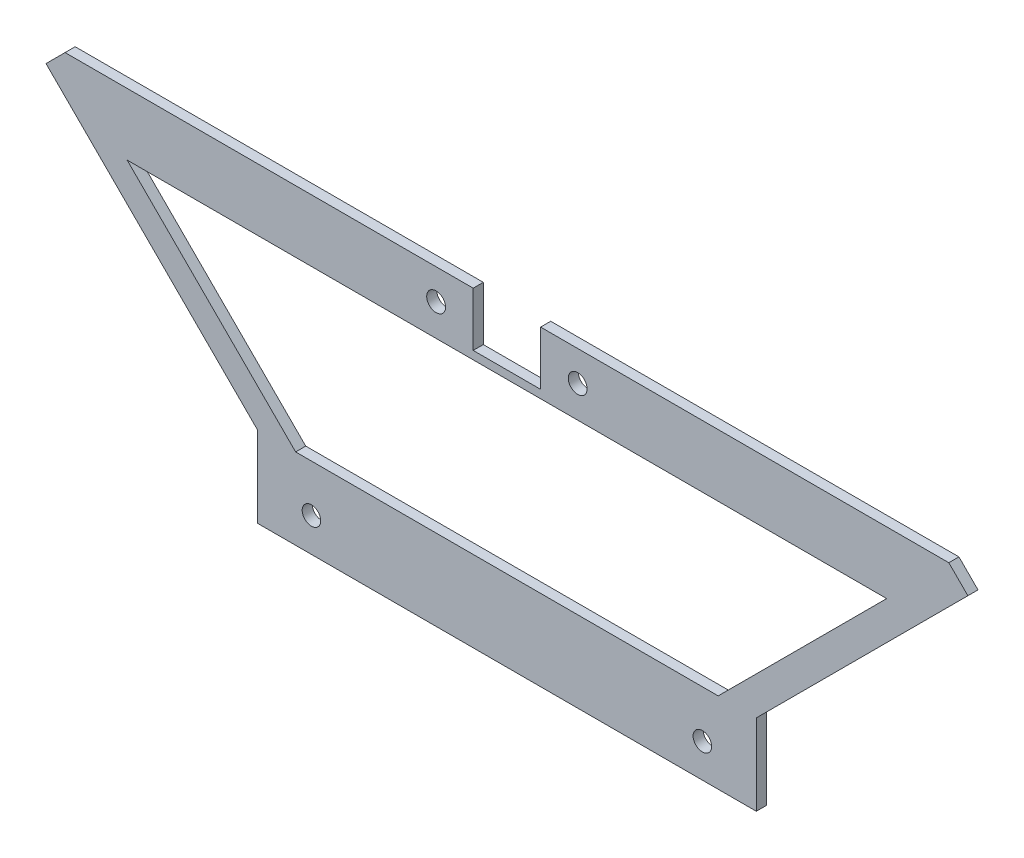
ISO-10303-21;
HEADER;
FILE_DESCRIPTION(('STEP AP214'),'2;1');
FILE_NAME('part.step','',(''),(''),'','','');
FILE_SCHEMA(('AUTOMOTIVE_DESIGN { 1 0 10303 214 1 1 1 1 }'));
ENDSEC;
DATA;
#1=APPLICATION_CONTEXT('core data for automotive mechanical design processes');
#2=APPLICATION_PROTOCOL_DEFINITION('international standard','automotive_design',2000,#1);
#3=PRODUCT_CONTEXT('',#1,'mechanical');
#4=PRODUCT('Part','Part','',(#3));
#5=PRODUCT_RELATED_PRODUCT_CATEGORY('part','',(#4));
#6=PRODUCT_DEFINITION_FORMATION('','',#4);
#7=PRODUCT_DEFINITION_CONTEXT('part definition',#1,'design');
#8=PRODUCT_DEFINITION('design','',#6,#7);
#9=PRODUCT_DEFINITION_SHAPE('','',#8);
#10=(LENGTH_UNIT() NAMED_UNIT(*) SI_UNIT(.MILLI.,.METRE.));
#11=(NAMED_UNIT(*) PLANE_ANGLE_UNIT() SI_UNIT($,.RADIAN.));
#12=(NAMED_UNIT(*) SI_UNIT($,.STERADIAN.) SOLID_ANGLE_UNIT());
#13=UNCERTAINTY_MEASURE_WITH_UNIT(LENGTH_MEASURE(1.E-05),#10,'distance_accuracy_value','');
#14=(GEOMETRIC_REPRESENTATION_CONTEXT(3) GLOBAL_UNCERTAINTY_ASSIGNED_CONTEXT((#13)) GLOBAL_UNIT_ASSIGNED_CONTEXT((#10,
#11,#12)) REPRESENTATION_CONTEXT('',''));
#15=CARTESIAN_POINT('',(0.,0.,0.));
#16=DIRECTION('',(0.,0.,1.));
#17=DIRECTION('',(1.,0.,0.));
#18=AXIS2_PLACEMENT_3D('',#15,#16,#17);
#19=CARTESIAN_POINT('',(37.,0.,1.5));
#20=DIRECTION('',(1.,0.,0.));
#21=DIRECTION('',(0.,0.,-1.));
#22=AXIS2_PLACEMENT_3D('',#19,#20,#21);
#23=PLANE('',#22);
#24=DIRECTION('',(0.,-1.,0.));
#25=VECTOR('',#24,1.);
#26=CARTESIAN_POINT('',(37.,0.,0.));
#27=LINE('',#26,#25);
#28=CARTESIAN_POINT('',(37.,12.,0.));
#29=VERTEX_POINT('',#28);
#30=CARTESIAN_POINT('',(37.,0.,0.));
#31=VERTEX_POINT('',#30);
#32=EDGE_CURVE('E281',#29,#31,#27,.T.);
#33=ORIENTED_EDGE('',*,*,#32,.F.);
#34=DIRECTION('',(0.,0.,-1.));
#35=VECTOR('',#34,1.);
#36=CARTESIAN_POINT('',(37.,12.,1.5));
#37=LINE('',#36,#35);
#38=CARTESIAN_POINT('',(37.,12.,1.5));
#39=VERTEX_POINT('',#38);
#40=EDGE_CURVE('E11',#39,#29,#37,.T.);
#41=ORIENTED_EDGE('',*,*,#40,.F.);
#42=DIRECTION('',(0.,-1.,0.));
#43=VECTOR('',#42,1.);
#44=CARTESIAN_POINT('',(37.,0.,1.5));
#45=LINE('',#44,#43);
#46=CARTESIAN_POINT('',(37.,0.,1.5));
#47=VERTEX_POINT('',#46);
#48=EDGE_CURVE('E340',#39,#47,#45,.T.);
#49=ORIENTED_EDGE('',*,*,#48,.T.);
#50=DIRECTION('',(0.,0.,-1.));
#51=VECTOR('',#50,1.);
#52=CARTESIAN_POINT('',(37.,0.,1.5));
#53=LINE('',#52,#51);
#54=EDGE_CURVE('E117',#47,#31,#53,.T.);
#55=ORIENTED_EDGE('',*,*,#54,.T.);
#56=EDGE_LOOP('',(#33,#41,#49,#55));
#57=FACE_BOUND('',#56,.T.);
#58=ADVANCED_FACE('F39',(#57),#23,.T.);
#59=CARTESIAN_POINT('',(12.5000000000001,-12.5,1.5));
#60=DIRECTION('',(0.707106781186548,-0.707106781186547,0.));
#61=DIRECTION('',(0.707106781186547,0.707106781186548,0.));
#62=AXIS2_PLACEMENT_3D('',#59,#60,#61);
#63=PLANE('',#62);
#64=DIRECTION('',(-0.707106781186547,-0.707106781186548,0.));
#65=VECTOR('',#64,1.);
#66=CARTESIAN_POINT('',(12.5000000000001,-12.5,0.));
#67=LINE('',#66,#65);
#68=CARTESIAN_POINT('',(68.3908729652601,43.3908729652602,0.));
#69=VERTEX_POINT('',#68);
#70=EDGE_CURVE('E277',#69,#29,#67,.T.);
#71=ORIENTED_EDGE('',*,*,#70,.F.);
#72=DIRECTION('',(0.,0.,-1.));
#73=VECTOR('',#72,1.);
#74=CARTESIAN_POINT('',(68.3908729652601,43.3908729652602,1.5));
#75=LINE('',#74,#73);
#76=CARTESIAN_POINT('',(68.3908729652601,43.3908729652602,1.5));
#77=VERTEX_POINT('',#76);
#78=EDGE_CURVE('E50',#77,#69,#75,.T.);
#79=ORIENTED_EDGE('',*,*,#78,.F.);
#80=DIRECTION('',(-0.707106781186547,-0.707106781186548,0.));
#81=VECTOR('',#80,1.);
#82=CARTESIAN_POINT('',(12.5000000000001,-12.5,1.5));
#83=LINE('',#82,#81);
#84=EDGE_CURVE('E336',#77,#39,#83,.T.);
#85=ORIENTED_EDGE('',*,*,#84,.T.);
#86=ORIENTED_EDGE('',*,*,#40,.T.);
#87=EDGE_LOOP('',(#71,#79,#85,#86));
#88=FACE_BOUND('',#87,.T.);
#89=ADVANCED_FACE('F388',(#88),#63,.T.);
#90=CARTESIAN_POINT('',(55.89087296526,55.8908729652602,1.5));
#91=DIRECTION('',(-0.707106781186546,-0.707106781186549,0.));
#92=DIRECTION('',(0.707106781186549,-0.707106781186546,0.));
#93=AXIS2_PLACEMENT_3D('',#90,#91,#92);
#94=PLANE('',#93);
#95=DIRECTION('',(-0.707106781186549,0.707106781186546,0.));
#96=VECTOR('',#95,1.);
#97=CARTESIAN_POINT('',(55.89087296526,55.8908729652602,0.));
#98=LINE('',#97,#96);
#99=CARTESIAN_POINT('',(65.5624458405139,46.2193000900063,0.));
#100=VERTEX_POINT('',#99);
#101=EDGE_CURVE('E273',#69,#100,#98,.T.);
#102=ORIENTED_EDGE('',*,*,#101,.T.);
#103=DIRECTION('',(0.,0.,-1.));
#104=VECTOR('',#103,1.);
#105=CARTESIAN_POINT('',(65.5624458405139,46.2193000900063,1.5));
#106=LINE('',#105,#104);
#107=CARTESIAN_POINT('',(65.5624458405139,46.2193000900063,1.5));
#108=VERTEX_POINT('',#107);
#109=EDGE_CURVE('E213',#108,#100,#106,.T.);
#110=ORIENTED_EDGE('',*,*,#109,.F.);
#111=DIRECTION('',(-0.707106781186549,0.707106781186546,0.));
#112=VECTOR('',#111,1.);
#113=CARTESIAN_POINT('',(55.89087296526,55.8908729652602,1.5));
#114=LINE('',#113,#112);
#115=EDGE_CURVE('E333',#77,#108,#114,.T.);
#116=ORIENTED_EDGE('',*,*,#115,.F.);
#117=ORIENTED_EDGE('',*,*,#78,.T.);
#118=EDGE_LOOP('',(#102,#110,#116,#117));
#119=FACE_BOUND('',#118,.T.);
#120=ADVANCED_FACE('F393',(#119),#94,.F.);
#121=CARTESIAN_POINT('',(-0.00378792139470435,46.2139259579782,1.5));
#122=DIRECTION('',(-8.19649338042512E-05,0.999999996640875,0.));
#123=DIRECTION('',(-0.999999996640875,-8.19649338042512E-05,0.));
#124=AXIS2_PLACEMENT_3D('',#121,#122,#123);
#125=PLANE('',#124);
#126=DIRECTION('',(0.999999996640875,8.19649338042512E-05,0.));
#127=VECTOR('',#126,1.);
#128=CARTESIAN_POINT('',(-0.00378792139470435,46.2139259579782,0.));
#129=LINE('',#128,#127);
#130=CARTESIAN_POINT('',(4.99999999999999,46.2143360931253,0.));
#131=VERTEX_POINT('',#130);
#132=EDGE_CURVE('E269',#131,#100,#129,.T.);
#133=ORIENTED_EDGE('',*,*,#132,.F.);
#134=DIRECTION('',(0.,0.,-1.));
#135=VECTOR('',#134,1.);
#136=CARTESIAN_POINT('',(4.99999999999999,46.2143360931253,1.5));
#137=LINE('',#136,#135);
#138=CARTESIAN_POINT('',(4.99999999999999,46.2143360931253,1.5));
#139=VERTEX_POINT('',#138);
#140=EDGE_CURVE('E210',#139,#131,#137,.T.);
#141=ORIENTED_EDGE('',*,*,#140,.F.);
#142=DIRECTION('',(0.999999996640875,8.19649338042512E-05,0.));
#143=VECTOR('',#142,1.);
#144=CARTESIAN_POINT('',(-0.00378792139470435,46.2139259579782,1.5));
#145=LINE('',#144,#143);
#146=EDGE_CURVE('E329',#139,#108,#145,.T.);
#147=ORIENTED_EDGE('',*,*,#146,.T.);
#148=ORIENTED_EDGE('',*,*,#109,.T.);
#149=EDGE_LOOP('',(#133,#141,#147,#148));
#150=FACE_BOUND('',#149,.T.);
#151=ADVANCED_FACE('F435',(#150),#125,.T.);
#152=CARTESIAN_POINT('',(4.99999999999999,0.,1.5));
#153=DIRECTION('',(-1.,0.,0.));
#154=DIRECTION('',(0.,0.,1.));
#155=AXIS2_PLACEMENT_3D('',#152,#153,#154);
#156=PLANE('',#155);
#157=DIRECTION('',(0.,1.,0.));
#158=VECTOR('',#157,1.);
#159=CARTESIAN_POINT('',(4.99999999999999,0.,0.));
#160=LINE('',#159,#158);
#161=CARTESIAN_POINT('',(4.99999999999999,38.2135164437845,0.));
#162=VERTEX_POINT('',#161);
#163=EDGE_CURVE('E265',#162,#131,#160,.T.);
#164=ORIENTED_EDGE('',*,*,#163,.F.);
#165=DIRECTION('',(0.,0.,-1.));
#166=VECTOR('',#165,1.);
#167=CARTESIAN_POINT('',(4.99999999999999,38.2135164437845,1.5));
#168=LINE('',#167,#166);
#169=CARTESIAN_POINT('',(4.99999999999999,38.2135164437845,1.5));
#170=VERTEX_POINT('',#169);
#171=EDGE_CURVE('E207',#170,#162,#168,.T.);
#172=ORIENTED_EDGE('',*,*,#171,.F.);
#173=DIRECTION('',(0.,1.,0.));
#174=VECTOR('',#173,1.);
#175=CARTESIAN_POINT('',(4.99999999999999,0.,1.5));
#176=LINE('',#175,#174);
#177=EDGE_CURVE('E325',#170,#139,#176,.T.);
#178=ORIENTED_EDGE('',*,*,#177,.T.);
#179=ORIENTED_EDGE('',*,*,#140,.T.);
#180=EDGE_LOOP('',(#164,#172,#178,#179));
#181=FACE_BOUND('',#180,.T.);
#182=ADVANCED_FACE('F442',(#181),#156,.T.);
#183=CARTESIAN_POINT('',(0.,38.2135164437845,1.5));
#184=DIRECTION('',(0.,1.,0.));
#185=DIRECTION('',(-1.,0.,0.));
#186=AXIS2_PLACEMENT_3D('',#183,#184,#185);
#187=PLANE('',#186);
#188=DIRECTION('',(1.,0.,0.));
#189=VECTOR('',#188,1.);
#190=CARTESIAN_POINT('',(0.,38.2135164437845,0.));
#191=LINE('',#190,#189);
#192=CARTESIAN_POINT('',(-5.00000000000001,38.2135164437845,0.));
#193=VERTEX_POINT('',#192);
#194=EDGE_CURVE('E261',#193,#162,#191,.T.);
#195=ORIENTED_EDGE('',*,*,#194,.F.);
#196=DIRECTION('',(0.,0.,-1.));
#197=VECTOR('',#196,1.);
#198=CARTESIAN_POINT('',(-5.00000000000001,38.2135164437845,1.5));
#199=LINE('',#198,#197);
#200=CARTESIAN_POINT('',(-5.00000000000001,38.2135164437845,1.5));
#201=VERTEX_POINT('',#200);
#202=EDGE_CURVE('E204',#201,#193,#199,.T.);
#203=ORIENTED_EDGE('',*,*,#202,.F.);
#204=DIRECTION('',(1.,0.,0.));
#205=VECTOR('',#204,1.);
#206=CARTESIAN_POINT('',(0.,38.2135164437845,1.5));
#207=LINE('',#206,#205);
#208=EDGE_CURVE('E321',#201,#170,#207,.T.);
#209=ORIENTED_EDGE('',*,*,#208,.T.);
#210=ORIENTED_EDGE('',*,*,#171,.T.);
#211=EDGE_LOOP('',(#195,#203,#209,#210));
#212=FACE_BOUND('',#211,.T.);
#213=ADVANCED_FACE('F438',(#212),#187,.T.);
#214=CARTESIAN_POINT('',(-5.,0.,1.5));
#215=DIRECTION('',(1.,0.,0.));
#216=DIRECTION('',(0.,1.,0.));
#217=AXIS2_PLACEMENT_3D('',#214,#215,#216);
#218=PLANE('',#217);
#219=DIRECTION('',(0.,-1.,0.));
#220=VECTOR('',#219,1.);
#221=CARTESIAN_POINT('',(-5.,0.,0.));
#222=LINE('',#221,#220);
#223=CARTESIAN_POINT('',(-5.00000000000001,46.2135164437845,0.));
#224=VERTEX_POINT('',#223);
#225=EDGE_CURVE('E257',#224,#193,#222,.T.);
#226=ORIENTED_EDGE('',*,*,#225,.F.);
#227=DIRECTION('',(0.,0.,-1.));
#228=VECTOR('',#227,1.);
#229=CARTESIAN_POINT('',(-5.00000000000001,46.2135164437845,1.5));
#230=LINE('',#229,#228);
#231=CARTESIAN_POINT('',(-5.00000000000001,46.2135164437845,1.5));
#232=VERTEX_POINT('',#231);
#233=EDGE_CURVE('E201',#232,#224,#230,.T.);
#234=ORIENTED_EDGE('',*,*,#233,.F.);
#235=DIRECTION('',(0.,-1.,0.));
#236=VECTOR('',#235,1.);
#237=CARTESIAN_POINT('',(-5.,0.,1.5));
#238=LINE('',#237,#236);
#239=EDGE_CURVE('E317',#232,#201,#238,.T.);
#240=ORIENTED_EDGE('',*,*,#239,.T.);
#241=ORIENTED_EDGE('',*,*,#202,.T.);
#242=EDGE_LOOP('',(#226,#234,#240,#241));
#243=FACE_BOUND('',#242,.T.);
#244=ADVANCED_FACE('F433',(#243),#218,.T.);
#245=CARTESIAN_POINT('',(-65.5516990782688,46.2085533277612,0.));
#246=VERTEX_POINT('',#245);
#247=EDGE_CURVE('E256',#246,#224,#129,.T.);
#248=ORIENTED_EDGE('',*,*,#247,.F.);
#249=DIRECTION('',(0.,0.,-1.));
#250=VECTOR('',#249,1.);
#251=CARTESIAN_POINT('',(-65.5516990782688,46.2085533277612,1.5));
#252=LINE('',#251,#250);
#253=CARTESIAN_POINT('',(-65.5516990782688,46.2085533277612,1.5));
#254=VERTEX_POINT('',#253);
#255=EDGE_CURVE('E194',#254,#246,#252,.T.);
#256=ORIENTED_EDGE('',*,*,#255,.F.);
#257=EDGE_CURVE('E316',#254,#232,#145,.T.);
#258=ORIENTED_EDGE('',*,*,#257,.T.);
#259=ORIENTED_EDGE('',*,*,#233,.T.);
#260=EDGE_LOOP('',(#248,#256,#258,#259));
#261=FACE_BOUND('',#260,.T.);
#262=ADVANCED_FACE('F429',(#261),#125,.T.);
#263=CARTESIAN_POINT('',(-55.8801262030152,55.8801262030149,1.5));
#264=DIRECTION('',(-0.707106781186549,0.707106781186546,0.));
#265=DIRECTION('',(-0.707106781186546,-0.707106781186549,0.));
#266=AXIS2_PLACEMENT_3D('',#263,#264,#265);
#267=PLANE('',#266);
#268=DIRECTION('',(0.707106781186546,0.707106781186549,0.));
#269=VECTOR('',#268,1.);
#270=CARTESIAN_POINT('',(-55.8801262030152,55.8801262030149,0.));
#271=LINE('',#270,#269);
#272=CARTESIAN_POINT('',(-68.380126203015,43.380126203015,0.));
#273=VERTEX_POINT('',#272);
#274=EDGE_CURVE('E252',#273,#246,#271,.T.);
#275=ORIENTED_EDGE('',*,*,#274,.F.);
#276=DIRECTION('',(0.,0.,-1.));
#277=VECTOR('',#276,1.);
#278=CARTESIAN_POINT('',(-68.380126203015,43.380126203015,1.5));
#279=LINE('',#278,#277);
#280=CARTESIAN_POINT('',(-68.380126203015,43.380126203015,1.5));
#281=VERTEX_POINT('',#280);
#282=EDGE_CURVE('E190',#281,#273,#279,.T.);
#283=ORIENTED_EDGE('',*,*,#282,.F.);
#284=DIRECTION('',(0.707106781186546,0.707106781186549,0.));
#285=VECTOR('',#284,1.);
#286=CARTESIAN_POINT('',(-55.8801262030152,55.8801262030149,1.5));
#287=LINE('',#286,#285);
#288=EDGE_CURVE('E182',#281,#254,#287,.T.);
#289=ORIENTED_EDGE('',*,*,#288,.T.);
#290=ORIENTED_EDGE('',*,*,#255,.T.);
#291=EDGE_LOOP('',(#275,#283,#289,#290));
#292=FACE_BOUND('',#291,.T.);
#293=ADVANCED_FACE('F426',(#292),#267,.T.);
#294=CARTESIAN_POINT('',(-12.5,-12.5,1.5));
#295=DIRECTION('',(0.707106781186547,0.707106781186548,0.));
#296=DIRECTION('',(-0.707106781186548,0.707106781186547,0.));
#297=AXIS2_PLACEMENT_3D('',#294,#295,#296);
#298=PLANE('',#297);
#299=DIRECTION('',(0.707106781186548,-0.707106781186547,0.));
#300=VECTOR('',#299,1.);
#301=CARTESIAN_POINT('',(-12.5,-12.5,0.));
#302=LINE('',#301,#300);
#303=CARTESIAN_POINT('',(-37.,12.,0.));
#304=VERTEX_POINT('',#303);
#305=EDGE_CURVE('E188',#273,#304,#302,.T.);
#306=ORIENTED_EDGE('',*,*,#305,.T.);
#307=DIRECTION('',(0.,0.,-1.));
#308=VECTOR('',#307,1.);
#309=CARTESIAN_POINT('',(-37.,12.,1.5));
#310=LINE('',#309,#308);
#311=CARTESIAN_POINT('',(-37.,12.,1.5));
#312=VERTEX_POINT('',#311);
#313=EDGE_CURVE('E170',#312,#304,#310,.T.);
#314=ORIENTED_EDGE('',*,*,#313,.F.);
#315=DIRECTION('',(0.707106781186548,-0.707106781186547,0.));
#316=VECTOR('',#315,1.);
#317=CARTESIAN_POINT('',(-12.5,-12.5,1.5));
#318=LINE('',#317,#316);
#319=EDGE_CURVE('E174',#281,#312,#318,.T.);
#320=ORIENTED_EDGE('',*,*,#319,.F.);
#321=ORIENTED_EDGE('',*,*,#282,.T.);
#322=EDGE_LOOP('',(#306,#314,#320,#321));
#323=FACE_BOUND('',#322,.T.);
#324=ADVANCED_FACE('F186',(#323),#298,.F.);
#325=CARTESIAN_POINT('',(-37.,0.,1.5));
#326=DIRECTION('',(1.,0.,0.));
#327=DIRECTION('',(0.,1.,0.));
#328=AXIS2_PLACEMENT_3D('',#325,#326,#327);
#329=PLANE('',#328);
#330=DIRECTION('',(0.,-1.,0.));
#331=VECTOR('',#330,1.);
#332=CARTESIAN_POINT('',(-37.,0.,0.));
#333=LINE('',#332,#331);
#334=CARTESIAN_POINT('',(-37.,0.,0.));
#335=VERTEX_POINT('',#334);
#336=EDGE_CURVE('E247',#304,#335,#333,.T.);
#337=ORIENTED_EDGE('',*,*,#336,.T.);
#338=DIRECTION('',(0.,0.,-1.));
#339=VECTOR('',#338,1.);
#340=CARTESIAN_POINT('',(-37.,0.,1.5));
#341=LINE('',#340,#339);
#342=CARTESIAN_POINT('',(-37.,0.,1.5));
#343=VERTEX_POINT('',#342);
#344=EDGE_CURVE('E172',#343,#335,#341,.T.);
#345=ORIENTED_EDGE('',*,*,#344,.F.);
#346=DIRECTION('',(0.,-1.,0.));
#347=VECTOR('',#346,1.);
#348=CARTESIAN_POINT('',(-37.,0.,1.5));
#349=LINE('',#348,#347);
#350=EDGE_CURVE('E165',#312,#343,#349,.T.);
#351=ORIENTED_EDGE('',*,*,#350,.F.);
#352=ORIENTED_EDGE('',*,*,#313,.T.);
#353=EDGE_LOOP('',(#337,#345,#351,#352));
#354=FACE_BOUND('',#353,.T.);
#355=ADVANCED_FACE('F168',(#354),#329,.F.);
#356=CARTESIAN_POINT('',(0.,37.,1.5));
#357=DIRECTION('',(0.,1.,0.));
#358=DIRECTION('',(-1.,0.,0.));
#359=AXIS2_PLACEMENT_3D('',#356,#357,#358);
#360=PLANE('',#359);
#361=DIRECTION('',(1.,0.,0.));
#362=VECTOR('',#361,1.);
#363=CARTESIAN_POINT('',(0.,37.,0.));
#364=LINE('',#363,#362);
#365=CARTESIAN_POINT('',(-56.3431457505076,37.,0.));
#366=VERTEX_POINT('',#365);
#367=CARTESIAN_POINT('',(56.3431457505075,37.,0.));
#368=VERTEX_POINT('',#367);
#369=EDGE_CURVE('E302',#366,#368,#364,.T.);
#370=ORIENTED_EDGE('',*,*,#369,.T.);
#371=DIRECTION('',(0.,0.,-1.));
#372=VECTOR('',#371,1.);
#373=CARTESIAN_POINT('',(56.3431457505075,37.,1.5));
#374=LINE('',#373,#372);
#375=CARTESIAN_POINT('',(56.3431457505075,37.,1.5));
#376=VERTEX_POINT('',#375);
#377=EDGE_CURVE('E43',#376,#368,#374,.T.);
#378=ORIENTED_EDGE('',*,*,#377,.F.);
#379=DIRECTION('',(1.,0.,0.));
#380=VECTOR('',#379,1.);
#381=CARTESIAN_POINT('',(0.,37.,1.5));
#382=LINE('',#381,#380);
#383=CARTESIAN_POINT('',(-56.3431457505076,37.,1.5));
#384=VERTEX_POINT('',#383);
#385=EDGE_CURVE('E240',#384,#376,#382,.T.);
#386=ORIENTED_EDGE('',*,*,#385,.F.);
#387=DIRECTION('',(0.,0.,-1.));
#388=VECTOR('',#387,1.);
#389=CARTESIAN_POINT('',(-56.3431457505076,37.,1.5));
#390=LINE('',#389,#388);
#391=EDGE_CURVE('E218',#384,#366,#390,.T.);
#392=ORIENTED_EDGE('',*,*,#391,.T.);
#393=EDGE_LOOP('',(#370,#378,#386,#392));
#394=FACE_BOUND('',#393,.T.);
#395=ADVANCED_FACE('F41',(#394),#360,.F.);
#396=CARTESIAN_POINT('',(9.67157287525386,-9.67157287525383,1.5));
#397=DIRECTION('',(0.707106781186548,-0.707106781186547,0.));
#398=DIRECTION('',(0.707106781186547,0.707106781186548,0.));
#399=AXIS2_PLACEMENT_3D('',#396,#397,#398);
#400=PLANE('',#399);
#401=DIRECTION('',(-0.707106781186547,-0.707106781186548,0.));
#402=VECTOR('',#401,1.);
#403=CARTESIAN_POINT('',(9.67157287525386,-9.67157287525383,0.));
#404=LINE('',#403,#402);
#405=CARTESIAN_POINT('',(31.3431457505076,12.,0.));
#406=VERTEX_POINT('',#405);
#407=EDGE_CURVE('E299',#368,#406,#404,.T.);
#408=ORIENTED_EDGE('',*,*,#407,.T.);
#409=DIRECTION('',(0.,0.,-1.));
#410=VECTOR('',#409,1.);
#411=CARTESIAN_POINT('',(31.3431457505076,12.,1.5));
#412=LINE('',#411,#410);
#413=CARTESIAN_POINT('',(31.3431457505076,12.,1.5));
#414=VERTEX_POINT('',#413);
#415=EDGE_CURVE('E224',#414,#406,#412,.T.);
#416=ORIENTED_EDGE('',*,*,#415,.F.);
#417=DIRECTION('',(-0.707106781186547,-0.707106781186548,0.));
#418=VECTOR('',#417,1.);
#419=CARTESIAN_POINT('',(9.67157287525386,-9.67157287525383,1.5));
#420=LINE('',#419,#418);
#421=EDGE_CURVE('E125',#376,#414,#420,.T.);
#422=ORIENTED_EDGE('',*,*,#421,.F.);
#423=ORIENTED_EDGE('',*,*,#377,.T.);
#424=EDGE_LOOP('',(#408,#416,#422,#423));
#425=FACE_BOUND('',#424,.T.);
#426=ADVANCED_FACE('F377',(#425),#400,.F.);
#427=CARTESIAN_POINT('',(0.,12.,1.5));
#428=DIRECTION('',(0.,-1.,0.));
#429=DIRECTION('',(1.,0.,0.));
#430=AXIS2_PLACEMENT_3D('',#427,#428,#429);
#431=PLANE('',#430);
#432=DIRECTION('',(-1.,0.,0.));
#433=VECTOR('',#432,1.);
#434=CARTESIAN_POINT('',(0.,12.,0.));
#435=LINE('',#434,#433);
#436=CARTESIAN_POINT('',(-31.3431457505076,12.,0.));
#437=VERTEX_POINT('',#436);
#438=EDGE_CURVE('E296',#406,#437,#435,.T.);
#439=ORIENTED_EDGE('',*,*,#438,.T.);
#440=DIRECTION('',(0.,0.,-1.));
#441=VECTOR('',#440,1.);
#442=CARTESIAN_POINT('',(-31.3431457505076,12.,1.5));
#443=LINE('',#442,#441);
#444=CARTESIAN_POINT('',(-31.3431457505076,12.,1.5));
#445=VERTEX_POINT('',#444);
#446=EDGE_CURVE('E221',#445,#437,#443,.T.);
#447=ORIENTED_EDGE('',*,*,#446,.F.);
#448=DIRECTION('',(-1.,0.,0.));
#449=VECTOR('',#448,1.);
#450=CARTESIAN_POINT('',(0.,12.,1.5));
#451=LINE('',#450,#449);
#452=EDGE_CURVE('E355',#414,#445,#451,.T.);
#453=ORIENTED_EDGE('',*,*,#452,.F.);
#454=ORIENTED_EDGE('',*,*,#415,.T.);
#455=EDGE_LOOP('',(#439,#447,#453,#454));
#456=FACE_BOUND('',#455,.T.);
#457=ADVANCED_FACE('F374',(#456),#431,.F.);
#458=CARTESIAN_POINT('',(10.4999999294584,41.7147868851409,1.5));
#459=DIRECTION('',(0.,0.,-1.));
#460=DIRECTION('',(-1.,0.,0.));
#461=AXIS2_PLACEMENT_3D('',#458,#459,#460);
#462=CYLINDRICAL_SURFACE('',#461,1.4);
#463=CARTESIAN_POINT('',(10.4999999294584,41.7147868851409,1.5));
#464=DIRECTION('',(0.,0.,1.));
#465=DIRECTION('',(1.,0.,0.));
#466=AXIS2_PLACEMENT_3D('',#463,#464,#465);
#467=CIRCLE('',#466,1.4);
#468=CARTESIAN_POINT('',(11.8999999294584,41.7147868851409,1.5));
#469=VERTEX_POINT('',#468);
#470=EDGE_CURVE('E308',#469,#469,#467,.T.);
#471=ORIENTED_EDGE('',*,*,#470,.T.);
#472=EDGE_LOOP('',(#471));
#473=FACE_BOUND('',#472,.T.);
#474=CARTESIAN_POINT('',(10.4999999294584,41.7147868851409,0.));
#475=DIRECTION('',(0.,0.,1.));
#476=DIRECTION('',(1.,0.,0.));
#477=AXIS2_PLACEMENT_3D('',#474,#475,#476);
#478=CIRCLE('',#477,1.4);
#479=CARTESIAN_POINT('',(11.8999999294584,41.7147868851409,0.));
#480=VERTEX_POINT('',#479);
#481=EDGE_CURVE('E241',#480,#480,#478,.T.);
#482=ORIENTED_EDGE('',*,*,#481,.F.);
#483=EDGE_LOOP('',(#482));
#484=FACE_BOUND('',#483,.T.);
#485=ADVANCED_FACE('F376',(#473,#484),#462,.F.);
#486=CARTESIAN_POINT('',(0.,0.,1.5));
#487=DIRECTION('',(0.,1.,0.));
#488=DIRECTION('',(0.,0.,1.));
#489=AXIS2_PLACEMENT_3D('',#486,#487,#488);
#490=PLANE('',#489);
#491=DIRECTION('',(1.,0.,0.));
#492=VECTOR('',#491,1.);
#493=CARTESIAN_POINT('',(0.,0.,0.));
#494=LINE('',#493,#492);
#495=EDGE_CURVE('E110',#335,#31,#494,.T.);
#496=ORIENTED_EDGE('',*,*,#495,.T.);
#497=ORIENTED_EDGE('',*,*,#54,.F.);
#498=DIRECTION('',(1.,0.,0.));
#499=VECTOR('',#498,1.);
#500=CARTESIAN_POINT('',(0.,0.,1.5));
#501=LINE('',#500,#499);
#502=EDGE_CURVE('E59',#343,#47,#501,.T.);
#503=ORIENTED_EDGE('',*,*,#502,.F.);
#504=ORIENTED_EDGE('',*,*,#344,.T.);
#505=EDGE_LOOP('',(#496,#497,#503,#504));
#506=FACE_BOUND('',#505,.T.);
#507=ADVANCED_FACE('F383',(#506),#490,.F.);
#508=CARTESIAN_POINT('',(-29.,4.99999999999999,1.5));
#509=DIRECTION('',(0.,0.,-1.));
#510=DIRECTION('',(-1.,0.,0.));
#511=AXIS2_PLACEMENT_3D('',#508,#509,#510);
#512=CYLINDRICAL_SURFACE('',#511,1.375);
#513=CARTESIAN_POINT('',(-29.,4.99999999999999,1.5));
#514=DIRECTION('',(0.,0.,1.));
#515=DIRECTION('',(1.,0.,0.));
#516=AXIS2_PLACEMENT_3D('',#513,#514,#515);
#517=CIRCLE('',#516,1.375);
#518=CARTESIAN_POINT('',(-27.625,4.99999999999999,1.5));
#519=VERTEX_POINT('',#518);
#520=EDGE_CURVE('E343',#519,#519,#517,.T.);
#521=ORIENTED_EDGE('',*,*,#520,.T.);
#522=EDGE_LOOP('',(#521));
#523=FACE_BOUND('',#522,.T.);
#524=CARTESIAN_POINT('',(-29.,4.99999999999999,0.));
#525=DIRECTION('',(0.,0.,1.));
#526=DIRECTION('',(1.,0.,0.));
#527=AXIS2_PLACEMENT_3D('',#524,#525,#526);
#528=CIRCLE('',#527,1.375);
#529=CARTESIAN_POINT('',(-27.625,4.99999999999999,0.));
#530=VERTEX_POINT('',#529);
#531=EDGE_CURVE('E284',#530,#530,#528,.T.);
#532=ORIENTED_EDGE('',*,*,#531,.F.);
#533=EDGE_LOOP('',(#532));
#534=FACE_BOUND('',#533,.T.);
#535=ADVANCED_FACE('F398',(#523,#534),#512,.F.);
#536=CARTESIAN_POINT('',(29.,5.,1.5));
#537=DIRECTION('',(0.,0.,-1.));
#538=DIRECTION('',(-1.,0.,0.));
#539=AXIS2_PLACEMENT_3D('',#536,#537,#538);
#540=CYLINDRICAL_SURFACE('',#539,1.375);
#541=CARTESIAN_POINT('',(29.,5.,1.5));
#542=DIRECTION('',(0.,0.,1.));
#543=DIRECTION('',(1.,0.,0.));
#544=AXIS2_PLACEMENT_3D('',#541,#542,#543);
#545=CIRCLE('',#544,1.375);
#546=CARTESIAN_POINT('',(30.375,5.,1.5));
#547=VERTEX_POINT('',#546);
#548=EDGE_CURVE('E347',#547,#547,#545,.T.);
#549=ORIENTED_EDGE('',*,*,#548,.T.);
#550=EDGE_LOOP('',(#549));
#551=FACE_BOUND('',#550,.T.);
#552=CARTESIAN_POINT('',(29.,5.,0.));
#553=DIRECTION('',(0.,0.,1.));
#554=DIRECTION('',(1.,0.,0.));
#555=AXIS2_PLACEMENT_3D('',#552,#553,#554);
#556=CIRCLE('',#555,1.375);
#557=CARTESIAN_POINT('',(30.375,5.,0.));
#558=VERTEX_POINT('',#557);
#559=EDGE_CURVE('E288',#558,#558,#556,.T.);
#560=ORIENTED_EDGE('',*,*,#559,.F.);
#561=EDGE_LOOP('',(#560));
#562=FACE_BOUND('',#561,.T.);
#563=ADVANCED_FACE('F401',(#551,#562),#540,.F.);
#564=CARTESIAN_POINT('',(-9.67157287525376,-9.67157287525378,1.5));
#565=DIRECTION('',(0.707106781186547,0.707106781186548,0.));
#566=DIRECTION('',(-0.707106781186548,0.707106781186547,0.));
#567=AXIS2_PLACEMENT_3D('',#564,#565,#566);
#568=PLANE('',#567);
#569=DIRECTION('',(0.707106781186548,-0.707106781186547,0.));
#570=VECTOR('',#569,1.);
#571=CARTESIAN_POINT('',(-9.67157287525376,-9.67157287525378,0.));
#572=LINE('',#571,#570);
#573=EDGE_CURVE('E292',#366,#437,#572,.T.);
#574=ORIENTED_EDGE('',*,*,#573,.F.);
#575=ORIENTED_EDGE('',*,*,#391,.F.);
#576=DIRECTION('',(0.707106781186548,-0.707106781186547,0.));
#577=VECTOR('',#576,1.);
#578=CARTESIAN_POINT('',(-9.67157287525376,-9.67157287525378,1.5));
#579=LINE('',#578,#577);
#580=EDGE_CURVE('E351',#384,#445,#579,.T.);
#581=ORIENTED_EDGE('',*,*,#580,.T.);
#582=ORIENTED_EDGE('',*,*,#446,.T.);
#583=EDGE_LOOP('',(#574,#575,#581,#582));
#584=FACE_BOUND('',#583,.T.);
#585=ADVANCED_FACE('F372',(#584),#568,.T.);
#586=CARTESIAN_POINT('',(-10.5,41.713065621531,1.5));
#587=DIRECTION('',(0.,0.,-1.));
#588=DIRECTION('',(-1.,0.,0.));
#589=AXIS2_PLACEMENT_3D('',#586,#587,#588);
#590=CYLINDRICAL_SURFACE('',#589,1.4);
#591=CARTESIAN_POINT('',(-10.5,41.713065621531,1.5));
#592=DIRECTION('',(0.,0.,1.));
#593=DIRECTION('',(1.,0.,0.));
#594=AXIS2_PLACEMENT_3D('',#591,#592,#593);
#595=CIRCLE('',#594,1.4);
#596=CARTESIAN_POINT('',(-9.10000000000001,41.713065621531,1.5));
#597=VERTEX_POINT('',#596);
#598=EDGE_CURVE('E222',#597,#597,#595,.T.);
#599=ORIENTED_EDGE('',*,*,#598,.T.);
#600=EDGE_LOOP('',(#599));
#601=FACE_BOUND('',#600,.T.);
#602=CARTESIAN_POINT('',(-10.5,41.713065621531,0.));
#603=DIRECTION('',(0.,0.,1.));
#604=DIRECTION('',(1.,0.,0.));
#605=AXIS2_PLACEMENT_3D('',#602,#603,#604);
#606=CIRCLE('',#605,1.4);
#607=CARTESIAN_POINT('',(-9.10000000000001,41.713065621531,0.));
#608=VERTEX_POINT('',#607);
#609=EDGE_CURVE('E236',#608,#608,#606,.T.);
#610=ORIENTED_EDGE('',*,*,#609,.F.);
#611=EDGE_LOOP('',(#610));
#612=FACE_BOUND('',#611,.T.);
#613=ADVANCED_FACE('F406',(#601,#612),#590,.F.);
#614=CARTESIAN_POINT('',(0.,0.,1.5));
#615=DIRECTION('',(0.,0.,1.));
#616=DIRECTION('',(1.,0.,0.));
#617=AXIS2_PLACEMENT_3D('',#614,#615,#616);
#618=PLANE('',#617);
#619=ORIENTED_EDGE('',*,*,#385,.T.);
#620=ORIENTED_EDGE('',*,*,#421,.T.);
#621=ORIENTED_EDGE('',*,*,#452,.T.);
#622=ORIENTED_EDGE('',*,*,#580,.F.);
#623=EDGE_LOOP('',(#619,#620,#621,#622));
#624=FACE_BOUND('',#623,.T.);
#625=ORIENTED_EDGE('',*,*,#548,.F.);
#626=EDGE_LOOP('',(#625));
#627=FACE_BOUND('',#626,.T.);
#628=ORIENTED_EDGE('',*,*,#520,.F.);
#629=EDGE_LOOP('',(#628));
#630=FACE_BOUND('',#629,.T.);
#631=ORIENTED_EDGE('',*,*,#48,.F.);
#632=ORIENTED_EDGE('',*,*,#84,.F.);
#633=ORIENTED_EDGE('',*,*,#115,.T.);
#634=ORIENTED_EDGE('',*,*,#146,.F.);
#635=ORIENTED_EDGE('',*,*,#177,.F.);
#636=ORIENTED_EDGE('',*,*,#208,.F.);
#637=ORIENTED_EDGE('',*,*,#239,.F.);
#638=ORIENTED_EDGE('',*,*,#257,.F.);
#639=ORIENTED_EDGE('',*,*,#288,.F.);
#640=ORIENTED_EDGE('',*,*,#319,.T.);
#641=ORIENTED_EDGE('',*,*,#350,.T.);
#642=ORIENTED_EDGE('',*,*,#502,.T.);
#643=EDGE_LOOP('',(#631,#632,#633,#634,#635,#636,#637,#638,#639,#640,#641,#642));
#644=FACE_BOUND('',#643,.T.);
#645=ORIENTED_EDGE('',*,*,#470,.F.);
#646=EDGE_LOOP('',(#645));
#647=FACE_BOUND('',#646,.T.);
#648=ORIENTED_EDGE('',*,*,#598,.F.);
#649=EDGE_LOOP('',(#648));
#650=FACE_BOUND('',#649,.T.);
#651=ADVANCED_FACE('F178',(#624,#627,#630,#644,#647,#650),#618,.T.);
#652=CARTESIAN_POINT('',(0.,0.,0.));
#653=DIRECTION('',(0.,0.,1.));
#654=DIRECTION('',(1.,0.,0.));
#655=AXIS2_PLACEMENT_3D('',#652,#653,#654);
#656=PLANE('',#655);
#657=ORIENTED_EDGE('',*,*,#369,.F.);
#658=ORIENTED_EDGE('',*,*,#573,.T.);
#659=ORIENTED_EDGE('',*,*,#438,.F.);
#660=ORIENTED_EDGE('',*,*,#407,.F.);
#661=EDGE_LOOP('',(#657,#658,#659,#660));
#662=FACE_BOUND('',#661,.T.);
#663=ORIENTED_EDGE('',*,*,#559,.T.);
#664=EDGE_LOOP('',(#663));
#665=FACE_BOUND('',#664,.T.);
#666=ORIENTED_EDGE('',*,*,#531,.T.);
#667=EDGE_LOOP('',(#666));
#668=FACE_BOUND('',#667,.T.);
#669=ORIENTED_EDGE('',*,*,#32,.T.);
#670=ORIENTED_EDGE('',*,*,#495,.F.);
#671=ORIENTED_EDGE('',*,*,#336,.F.);
#672=ORIENTED_EDGE('',*,*,#305,.F.);
#673=ORIENTED_EDGE('',*,*,#274,.T.);
#674=ORIENTED_EDGE('',*,*,#247,.T.);
#675=ORIENTED_EDGE('',*,*,#225,.T.);
#676=ORIENTED_EDGE('',*,*,#194,.T.);
#677=ORIENTED_EDGE('',*,*,#163,.T.);
#678=ORIENTED_EDGE('',*,*,#132,.T.);
#679=ORIENTED_EDGE('',*,*,#101,.F.);
#680=ORIENTED_EDGE('',*,*,#70,.T.);
#681=EDGE_LOOP('',(#669,#670,#671,#672,#673,#674,#675,#676,#677,#678,#679,#680));
#682=FACE_BOUND('',#681,.T.);
#683=ORIENTED_EDGE('',*,*,#481,.T.);
#684=EDGE_LOOP('',(#683));
#685=FACE_BOUND('',#684,.T.);
#686=ORIENTED_EDGE('',*,*,#609,.T.);
#687=EDGE_LOOP('',(#686));
#688=FACE_BOUND('',#687,.T.);
#689=ADVANCED_FACE('F369',(#662,#665,#668,#682,#685,#688),#656,.F.);
#690=CLOSED_SHELL('',(#58,#89,#120,#151,#182,#213,#244,#262,#293,#324,#355,#395,#426,#457,#485,
#507,#535,#563,#585,#613,#651,#689));
#691=MANIFOLD_SOLID_BREP('B2',#690);
#692=ADVANCED_BREP_SHAPE_REPRESENTATION('',(#18,#691),#14);
#693=SHAPE_DEFINITION_REPRESENTATION(#9,#692);
ENDSEC;
END-ISO-10303-21;
